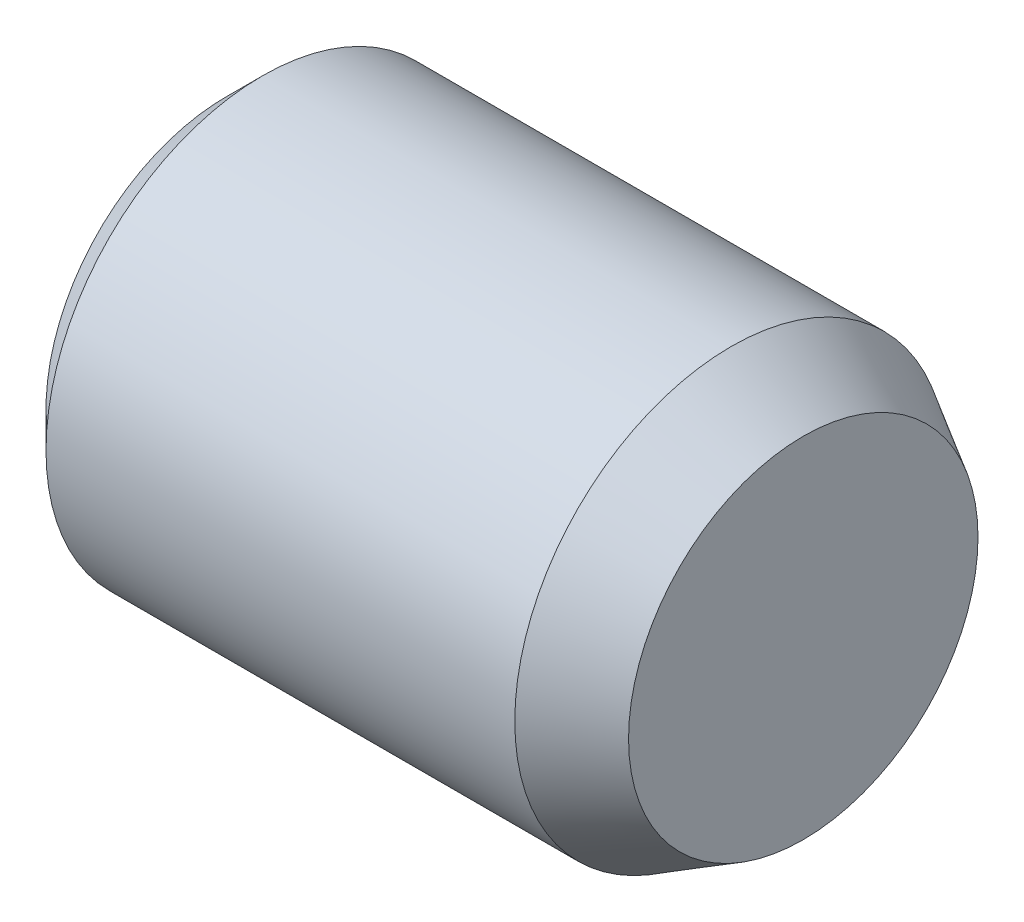
ISO-10303-21;
HEADER;
FILE_DESCRIPTION(('STEP AP214'),'2;1');
FILE_NAME('part.step','',(''),(''),'','','');
FILE_SCHEMA(('AUTOMOTIVE_DESIGN { 1 0 10303 214 1 1 1 1 }'));
ENDSEC;
DATA;
#1=APPLICATION_CONTEXT('core data for automotive mechanical design processes');
#2=APPLICATION_PROTOCOL_DEFINITION('international standard','automotive_design',2000,#1);
#3=PRODUCT_CONTEXT('',#1,'mechanical');
#4=PRODUCT('Part','Part','',(#3));
#5=PRODUCT_RELATED_PRODUCT_CATEGORY('part','',(#4));
#6=PRODUCT_DEFINITION_FORMATION('','',#4);
#7=PRODUCT_DEFINITION_CONTEXT('part definition',#1,'design');
#8=PRODUCT_DEFINITION('design','',#6,#7);
#9=PRODUCT_DEFINITION_SHAPE('','',#8);
#10=(LENGTH_UNIT() NAMED_UNIT(*) SI_UNIT(.MILLI.,.METRE.));
#11=(NAMED_UNIT(*) PLANE_ANGLE_UNIT() SI_UNIT($,.RADIAN.));
#12=(NAMED_UNIT(*) SI_UNIT($,.STERADIAN.) SOLID_ANGLE_UNIT());
#13=UNCERTAINTY_MEASURE_WITH_UNIT(LENGTH_MEASURE(1.E-05),#10,'distance_accuracy_value','');
#14=(GEOMETRIC_REPRESENTATION_CONTEXT(3) GLOBAL_UNCERTAINTY_ASSIGNED_CONTEXT((#13)) GLOBAL_UNIT_ASSIGNED_CONTEXT((#10,
#11,#12)) REPRESENTATION_CONTEXT('',''));
#15=CARTESIAN_POINT('',(0.,0.,0.));
#16=DIRECTION('',(0.,0.,1.));
#17=DIRECTION('',(1.,0.,0.));
#18=AXIS2_PLACEMENT_3D('',#15,#16,#17);
#19=CARTESIAN_POINT('',(8.00000000000001,0.,-2.42264973081037));
#20=DIRECTION('',(1.,0.,0.));
#21=DIRECTION('',(0.,0.,-1.));
#22=AXIS2_PLACEMENT_3D('',#19,#20,#21);
#23=PLANE('',#22);
#24=CARTESIAN_POINT('',(8.,0.,0.));
#25=DIRECTION('',(1.,0.,0.));
#26=DIRECTION('',(0.,0.,-1.));
#27=AXIS2_PLACEMENT_3D('',#24,#25,#26);
#28=CIRCLE('',#27,2.42264973081038);
#29=CARTESIAN_POINT('',(8.,0.,-2.42264973081037));
#30=VERTEX_POINT('',#29);
#31=EDGE_CURVE('E65',#30,#30,#28,.T.);
#32=ORIENTED_EDGE('',*,*,#31,.T.);
#33=EDGE_LOOP('',(#32));
#34=FACE_BOUND('',#33,.T.);
#35=ADVANCED_FACE('F53',(#34),#23,.T.);
#36=CARTESIAN_POINT('',(8.,0.,0.));
#37=DIRECTION('',(-1.,0.,0.));
#38=DIRECTION('',(0.,0.,1.));
#39=AXIS2_PLACEMENT_3D('',#36,#37,#38);
#40=CONICAL_SURFACE('',#39,2.42264973081038,0.523598775598298);
#41=CARTESIAN_POINT('',(6.99999999999999,0.,0.));
#42=DIRECTION('',(1.,0.,0.));
#43=DIRECTION('',(0.,0.,-1.));
#44=AXIS2_PLACEMENT_3D('',#41,#42,#43);
#45=CIRCLE('',#44,3.00000000000001);
#46=CARTESIAN_POINT('',(7.,0.,-3.));
#47=VERTEX_POINT('',#46);
#48=EDGE_CURVE('E248',#47,#47,#45,.T.);
#49=ORIENTED_EDGE('',*,*,#48,.T.);
#50=EDGE_LOOP('',(#49));
#51=FACE_BOUND('',#50,.T.);
#52=ORIENTED_EDGE('',*,*,#31,.F.);
#53=EDGE_LOOP('',(#52));
#54=FACE_BOUND('',#53,.T.);
#55=ADVANCED_FACE('F237',(#51,#54),#40,.T.);
#56=CARTESIAN_POINT('',(8.00000000000001,0.,0.));
#57=DIRECTION('',(1.,0.,0.));
#58=DIRECTION('',(0.,0.,-1.));
#59=AXIS2_PLACEMENT_3D('',#56,#57,#58);
#60=CYLINDRICAL_SURFACE('',#59,3.);
#61=CARTESIAN_POINT('',(0.499999999999996,0.,0.));
#62=DIRECTION('',(1.,0.,0.));
#63=DIRECTION('',(0.,0.,-1.));
#64=AXIS2_PLACEMENT_3D('',#61,#62,#63);
#65=CIRCLE('',#64,3.);
#66=CARTESIAN_POINT('',(0.499999999999999,0.,-3.));
#67=VERTEX_POINT('',#66);
#68=EDGE_CURVE('E251',#67,#67,#65,.T.);
#69=ORIENTED_EDGE('',*,*,#68,.T.);
#70=EDGE_LOOP('',(#69));
#71=FACE_BOUND('',#70,.T.);
#72=ORIENTED_EDGE('',*,*,#48,.F.);
#73=EDGE_LOOP('',(#72));
#74=FACE_BOUND('',#73,.T.);
#75=ADVANCED_FACE('F234',(#71,#74),#60,.T.);
#76=CARTESIAN_POINT('',(0.499999999999996,0.,0.));
#77=DIRECTION('',(1.,0.,0.));
#78=DIRECTION('',(0.,0.,-1.));
#79=AXIS2_PLACEMENT_3D('',#76,#77,#78);
#80=CONICAL_SURFACE('',#79,3.,0.785398163397452);
#81=CARTESIAN_POINT('',(0.,0.,0.));
#82=DIRECTION('',(1.,0.,0.));
#83=DIRECTION('',(0.,0.,-1.));
#84=AXIS2_PLACEMENT_3D('',#81,#82,#83);
#85=CIRCLE('',#84,2.5);
#86=CARTESIAN_POINT('',(0.,0.,-2.5));
#87=VERTEX_POINT('',#86);
#88=EDGE_CURVE('E219',#87,#87,#85,.T.);
#89=ORIENTED_EDGE('',*,*,#88,.T.);
#90=EDGE_LOOP('',(#89));
#91=FACE_BOUND('',#90,.T.);
#92=ORIENTED_EDGE('',*,*,#68,.F.);
#93=EDGE_LOOP('',(#92));
#94=FACE_BOUND('',#93,.T.);
#95=ADVANCED_FACE('F231',(#91,#94),#80,.T.);
#96=CARTESIAN_POINT('',(0.,0.,0.));
#97=DIRECTION('',(-1.,0.,0.));
#98=DIRECTION('',(0.,0.,1.));
#99=AXIS2_PLACEMENT_3D('',#96,#97,#98);
#100=PLANE('',#99);
#101=CARTESIAN_POINT('',(0.,0.,0.));
#102=DIRECTION('',(1.,0.,0.));
#103=DIRECTION('',(0.,0.,-1.));
#104=AXIS2_PLACEMENT_3D('',#101,#102,#103);
#105=CIRCLE('',#104,1.75);
#106=CARTESIAN_POINT('',(0.,1.51554445662277,0.875000000000002));
#107=VERTEX_POINT('',#106);
#108=CARTESIAN_POINT('',(0.,0.,1.75));
#109=VERTEX_POINT('',#108);
#110=EDGE_CURVE('E78',#107,#109,#105,.T.);
#111=ORIENTED_EDGE('',*,*,#110,.T.);
#112=CARTESIAN_POINT('',(0.,-1.51554445662277,0.874999999999999));
#113=VERTEX_POINT('',#112);
#114=EDGE_CURVE('E151',#109,#113,#105,.T.);
#115=ORIENTED_EDGE('',*,*,#114,.T.);
#116=CARTESIAN_POINT('',(0.,-1.51554445662277,-0.875));
#117=VERTEX_POINT('',#116);
#118=EDGE_CURVE('E150',#113,#117,#105,.T.);
#119=ORIENTED_EDGE('',*,*,#118,.T.);
#120=CARTESIAN_POINT('',(0.,0.,-1.75));
#121=VERTEX_POINT('',#120);
#122=EDGE_CURVE('E123',#117,#121,#105,.T.);
#123=ORIENTED_EDGE('',*,*,#122,.T.);
#124=CARTESIAN_POINT('',(0.,1.51554445662277,-0.875));
#125=VERTEX_POINT('',#124);
#126=EDGE_CURVE('E113',#121,#125,#105,.T.);
#127=ORIENTED_EDGE('',*,*,#126,.T.);
#128=EDGE_CURVE('E71',#125,#107,#105,.T.);
#129=ORIENTED_EDGE('',*,*,#128,.T.);
#130=EDGE_LOOP('',(#111,#115,#119,#123,#127,#129));
#131=FACE_BOUND('',#130,.T.);
#132=ORIENTED_EDGE('',*,*,#88,.F.);
#133=EDGE_LOOP('',(#132));
#134=FACE_BOUND('',#133,.T.);
#135=ADVANCED_FACE('F146',(#131,#134),#100,.T.);
#136=CARTESIAN_POINT('',(1.01036297108183,0.,0.));
#137=DIRECTION('',(-1.,0.,0.));
#138=DIRECTION('',(0.,0.,1.));
#139=AXIS2_PLACEMENT_3D('',#136,#137,#138);
#140=CONICAL_SURFACE('',#139,0.,1.0471975511966);
#141=ORIENTED_EDGE('',*,*,#122,.F.);
#142=CARTESIAN_POINT('',(-6.66732645178177E-05,0.000199999999998916,-1.75011547005384));
#143=CARTESIAN_POINT('',(0.0221449044294816,-0.0664023758266682,-1.71166257044164));
#144=CARTESIAN_POINT('',(0.0423460081489116,-0.133579654948439,-1.67287775025726));
#145=CARTESIAN_POINT('',(0.0776083474159661,-0.269097617942885,-1.59463641784239));
#146=CARTESIAN_POINT('',(0.0926571065259684,-0.337440710961869,-1.55517851469063));
#147=CARTESIAN_POINT('',(0.116084211207472,-0.473279853923202,-1.47675174893541));
#148=CARTESIAN_POINT('',(0.124618450794631,-0.540754995382695,-1.43779495785017));
#149=CARTESIAN_POINT('',(0.134809186377334,-0.67602300220127,-1.35969793770072));
#150=CARTESIAN_POINT('',(0.136474118399416,-0.743815375430541,-1.32055799276779));
#151=CARTESIAN_POINT('',(0.133022665272731,-0.870504512969003,-1.24741398510656));
#152=CARTESIAN_POINT('',(0.128753732616468,-0.929420178792214,-1.21339900958404));
#153=CARTESIAN_POINT('',(0.115219935358477,-1.04686764927936,-1.14559068088265));
#154=CARTESIAN_POINT('',(0.105950441250569,-1.10539904728372,-1.11179756248879));
#155=CARTESIAN_POINT('',(0.0827759335055034,-1.22308895120114,-1.04384926478116));
#156=CARTESIAN_POINT('',(0.0687726192813939,-1.28223255076041,-1.00970269165477));
#157=CARTESIAN_POINT('',(0.0369900311307231,-1.39963730186323,-0.94191902700142));
#158=CARTESIAN_POINT('',(0.0192182319127623,-1.45789995919933,-0.908281066104725));
#159=CARTESIAN_POINT('',(-6.66732645180497E-05,-1.51574445662277,-0.874884529946162));
#160=B_SPLINE_CURVE_WITH_KNOTS('',3,(#142,#143,#144,#145,#146,#147,#148,#149,#150,#151,#152,
#153,#154,#155,#156,#157,#158,#159),.UNSPECIFIED.,.F.,.F.,(4,2,2,2,2,2,2,2,4),(0.,
0.240241742982347,0.48106118528765,0.715919550387317,0.950489405737162,1.1547861330808,
1.35927232318102,1.56829619115677,1.776909279336),.UNSPECIFIED.);
#161=EDGE_CURVE('E12',#121,#117,#160,.T.);
#162=ORIENTED_EDGE('',*,*,#161,.F.);
#163=EDGE_LOOP('',(#141,#162));
#164=FACE_BOUND('',#163,.T.);
#165=ADVANCED_FACE('F126',(#164),#140,.F.);
#166=ORIENTED_EDGE('',*,*,#118,.F.);
#167=CARTESIAN_POINT('',(-0.563532910625823,-1.51554445662277,-2.26595890063548));
#168=CARTESIAN_POINT('',(-0.532134136522706,-1.51554445662277,-2.20051238173922));
#169=CARTESIAN_POINT('',(-0.501061575387705,-1.51554445662277,-2.13490656080575));
#170=CARTESIAN_POINT('',(-0.439753726867235,-1.51554445662277,-2.00329107063982));
#171=CARTESIAN_POINT('',(-0.40951859016251,-1.51554445662277,-1.93728133130437));
#172=CARTESIAN_POINT('',(-0.349901528563981,-1.51554445662277,-1.80439427853863));
#173=CARTESIAN_POINT('',(-0.320525891839148,-1.51554445662277,-1.73751413131939));
#174=CARTESIAN_POINT('',(-0.263092541592034,-1.51554445662277,-1.60319370986659));
#175=CARTESIAN_POINT('',(-0.235034759543454,-1.51554445662277,-1.53575346497229));
#176=CARTESIAN_POINT('',(-0.179870409798184,-1.51554445662277,-1.39842418954726));
#177=CARTESIAN_POINT('',(-0.152807880866062,-1.51554445662277,-1.32851723061006));
#178=CARTESIAN_POINT('',(-0.100941901639626,-1.51554445662277,-1.18787293487851));
#179=CARTESIAN_POINT('',(-0.0761387344229645,-1.51554445662277,-1.11713549528237));
#180=CARTESIAN_POINT('',(-0.00616431075382538,-1.51554445662277,-0.903792542480807));
#181=CARTESIAN_POINT('',(0.0347360182332324,-1.51554445662277,-0.75966597796381));
#182=CARTESIAN_POINT('',(0.0821783893640379,-1.51554445662277,-0.540592384258889));
#183=CARTESIAN_POINT('',(0.0956683672209716,-1.51554445662277,-0.467157121979347));
#184=CARTESIAN_POINT('',(0.117087506531198,-1.51554445662277,-0.319460515174022));
#185=CARTESIAN_POINT('',(0.125017043769635,-1.51554445662277,-0.245199226817297));
#186=CARTESIAN_POINT('',(0.134581825656484,-1.51554445662277,-0.0971554284905994));
#187=CARTESIAN_POINT('',(0.136291347416933,-1.51554445662277,-0.0233778427974436));
#188=CARTESIAN_POINT('',(0.133469528969136,-1.51554445662277,0.124055476761426));
#189=CARTESIAN_POINT('',(0.128937802325276,-1.51554445662277,0.197711202799313));
#190=CARTESIAN_POINT('',(0.110455270834107,-1.51554445662277,0.379445773535024));
#191=CARTESIAN_POINT('',(0.0930407915022481,-1.51554445662277,0.487172440096383));
#192=CARTESIAN_POINT('',(0.0481338740010091,-1.51554445662277,0.700530899803827));
#193=CARTESIAN_POINT('',(0.0206292894732057,-1.51554445662277,0.806160005705216));
#194=CARTESIAN_POINT('',(-0.026355262163589,-1.51554445662277,0.964139948179183));
#195=CARTESIAN_POINT('',(-0.043190525892397,-1.51554445662277,1.01730740210717));
#196=CARTESIAN_POINT('',(-0.0784184116572895,-1.51554445662277,1.12308887131315));
#197=CARTESIAN_POINT('',(-0.0968100617815138,-1.51554445662277,1.17570320924792));
#198=CARTESIAN_POINT('',(-0.134883619482846,-1.51554445662277,1.28044875805814));
#199=CARTESIAN_POINT('',(-0.154565292575557,-1.51554445662277,1.33258005477944));
#200=CARTESIAN_POINT('',(-0.19500600733766,-1.51554445662277,1.43643187136538));
#201=CARTESIAN_POINT('',(-0.215765231032693,-1.51554445662277,1.48815232011474));
#202=CARTESIAN_POINT('',(-0.270083826942637,-1.51554445662277,1.62017096585258));
#203=CARTESIAN_POINT('',(-0.304284098149476,-1.51554445662277,1.70020518507784));
#204=CARTESIAN_POINT('',(-0.374333292503037,-1.51554445662277,1.85955088568122));
#205=CARTESIAN_POINT('',(-0.410182339157162,-1.51554445662277,1.93886231238105));
#206=CARTESIAN_POINT('',(-0.519621429974216,-1.51554445662277,2.17595323636037));
#207=CARTESIAN_POINT('',(-0.595092205304239,-1.51554445662277,2.33286289433754));
#208=CARTESIAN_POINT('',(-0.749198987368698,-1.51554445662277,2.64534167964294));
#209=CARTESIAN_POINT('',(-0.827838771195659,-1.51554445662277,2.80090892186687));
#210=CARTESIAN_POINT('',(-0.987140420712237,-1.51554445662277,3.11097754763085));
#211=CARTESIAN_POINT('',(-1.0678020293755,-1.51554445662277,3.26547906349981));
#212=CARTESIAN_POINT('',(-1.22283902934283,-1.51554445662277,3.55919636558155));
#213=CARTESIAN_POINT('',(-1.29708915995521,-1.51554445662277,3.69847850014597));
#214=CARTESIAN_POINT('',(-1.44643542457996,-1.51554445662277,3.97659474012283));
#215=CARTESIAN_POINT('',(-1.52153158990073,-1.51554445662277,4.11542882870866));
#216=CARTESIAN_POINT('',(-1.67216594590895,-1.51554445662277,4.39239913173627));
#217=CARTESIAN_POINT('',(-1.74770252645472,-1.51554445662277,4.53053622304851));
#218=CARTESIAN_POINT('',(-1.89926732048614,-1.51554445662277,4.80653112590675));
#219=CARTESIAN_POINT('',(-1.97529550803658,-1.51554445662277,4.94438895168981));
#220=CARTESIAN_POINT('',(-2.05150396895533,-1.51554445662277,5.08214644372616));
#221=B_SPLINE_CURVE_WITH_KNOTS('',3,(#167,#168,#169,#170,#171,#172,#173,#174,#175,#176,#177,
#178,#179,#180,#181,#182,#183,#184,#185,#186,#187,#188,#189,#190,#191,#192,#193,#194,#195,#196,
#197,#198,#199,#200,#201,#202,#203,#204,#205,#206,#207,#208,#209,#210,#211,#212,#213,#214,#215,
#216,#217,#218,#219,#220),.UNSPECIFIED.,.F.,.F.,(4,2,2,2,2,2,2,2,2,2,2,2,2,2,2,2,2,2,2,2,2,2,2,
2,2,2,4),(0.,0.217769099854901,0.435577132416358,0.654706396228358,0.873824253032143,
1.09867004545086,1.32354397038355,1.77202325337813,1.99584540337777,2.21965242559296,
2.44077789001242,2.66191704633946,2.98862090595863,3.31571934559679,3.48300853865819,
3.65019402532678,3.81734920691363,3.98453271773258,4.24561154627739,4.50670996381743,
5.02899303776686,5.55191817592407,6.07477717055938,6.54828558680916,7.02181158367171,
7.49413315360125,7.96643000581034),.UNSPECIFIED.);
#222=EDGE_CURVE('E121',#117,#113,#221,.T.);
#223=ORIENTED_EDGE('',*,*,#222,.F.);
#224=EDGE_LOOP('',(#166,#223));
#225=FACE_BOUND('',#224,.T.);
#226=ADVANCED_FACE('F291',(#225),#140,.F.);
#227=ORIENTED_EDGE('',*,*,#114,.F.);
#228=CARTESIAN_POINT('',(-6.66732645185368E-05,-1.51574445662277,0.874884529946163));
#229=CARTESIAN_POINT('',(0.0221449044294809,-1.4491420807961,0.913337429558358));
#230=CARTESIAN_POINT('',(0.042346008148911,-1.38196480167433,0.952122249742738));
#231=CARTESIAN_POINT('',(0.0776083474159657,-1.24644683867988,1.03036358215761));
#232=CARTESIAN_POINT('',(0.0926571065259681,-1.1781037456609,1.06982148530937));
#233=CARTESIAN_POINT('',(0.116084211207472,-1.04226460269957,1.14824825106459));
#234=CARTESIAN_POINT('',(0.12461845079463,-0.974789461240073,1.18720504214983));
#235=CARTESIAN_POINT('',(0.134809186377333,-0.839521454421498,1.26530206229928));
#236=CARTESIAN_POINT('',(0.136474118399415,-0.771729081192227,1.30444200723221));
#237=CARTESIAN_POINT('',(0.133022665272731,-0.645039943653765,1.37758601489344));
#238=CARTESIAN_POINT('',(0.128753732616468,-0.586124277830555,1.41160099041595));
#239=CARTESIAN_POINT('',(0.115219935358476,-0.468676807343404,1.47940931911735));
#240=CARTESIAN_POINT('',(0.105950441250569,-0.410145409339049,1.51320243751121));
#241=CARTESIAN_POINT('',(0.0827759335055031,-0.29245550542163,1.58115073521883));
#242=CARTESIAN_POINT('',(0.0687726192813938,-0.233311905862355,1.61529730834522));
#243=CARTESIAN_POINT('',(0.0369900311307233,-0.115907154759535,1.68308097299858));
#244=CARTESIAN_POINT('',(0.0192182319127625,-0.0576444974234433,1.71671893389527));
#245=CARTESIAN_POINT('',(-6.66732645178481E-05,0.000199999999998933,1.75011547005384));
#246=B_SPLINE_CURVE_WITH_KNOTS('',3,(#228,#229,#230,#231,#232,#233,#234,#235,#236,#237,#238,
#239,#240,#241,#242,#243,#244,#245),.UNSPECIFIED.,.F.,.F.,(4,2,2,2,2,2,2,2,4),(0.,
0.240241742982347,0.48106118528765,0.715919550387317,0.950489405737162,1.1547861330808,
1.35927232318102,1.56829619115677,1.776909279336),.UNSPECIFIED.);
#247=EDGE_CURVE('E159',#113,#109,#246,.T.);
#248=ORIENTED_EDGE('',*,*,#247,.F.);
#249=EDGE_LOOP('',(#227,#248));
#250=FACE_BOUND('',#249,.T.);
#251=ADVANCED_FACE('F298',(#250),#140,.F.);
#252=ORIENTED_EDGE('',*,*,#110,.F.);
#253=CARTESIAN_POINT('',(-6.66732645191923E-05,-0.000200000000001084,1.75011547005384));
#254=CARTESIAN_POINT('',(0.0221449044294803,0.0664023758266661,1.71166257044164));
#255=CARTESIAN_POINT('',(0.0423460081489104,0.133579654948437,1.67287775025726));
#256=CARTESIAN_POINT('',(0.077608347415965,0.269097617942883,1.59463641784239));
#257=CARTESIAN_POINT('',(0.0926571065259673,0.337440710961867,1.55517851469063));
#258=CARTESIAN_POINT('',(0.116084211207471,0.4732798539232,1.47675174893542));
#259=CARTESIAN_POINT('',(0.12461845079463,0.540754995382694,1.43779495785017));
#260=CARTESIAN_POINT('',(0.134809186377333,0.676023002201269,1.35969793770072));
#261=CARTESIAN_POINT('',(0.136474118399415,0.74381537543054,1.3205579927678));
#262=CARTESIAN_POINT('',(0.133022665272731,0.870504512969002,1.24741398510656));
#263=CARTESIAN_POINT('',(0.128753732616468,0.929420178792213,1.21339900958405));
#264=CARTESIAN_POINT('',(0.115219935358476,1.04686764927936,1.14559068088265));
#265=CARTESIAN_POINT('',(0.105950441250569,1.10539904728372,1.11179756248879));
#266=CARTESIAN_POINT('',(0.0827759335055029,1.22308895120114,1.04384926478117));
#267=CARTESIAN_POINT('',(0.0687726192813935,1.28223255076041,1.00970269165478));
#268=CARTESIAN_POINT('',(0.0369900311307229,1.39963730186323,0.941919027001423));
#269=CARTESIAN_POINT('',(0.0192182319127622,1.45789995919932,0.908281066104727));
#270=CARTESIAN_POINT('',(-6.66732645180673E-05,1.51574445662277,0.874884529946164));
#271=B_SPLINE_CURVE_WITH_KNOTS('',3,(#253,#254,#255,#256,#257,#258,#259,#260,#261,#262,#263,
#264,#265,#266,#267,#268,#269,#270),.UNSPECIFIED.,.F.,.F.,(4,2,2,2,2,2,2,2,4),(0.,
0.240241742982347,0.481061185287651,0.715919550387318,0.950489405737162,1.1547861330808,
1.35927232318102,1.56829619115677,1.776909279336),.UNSPECIFIED.);
#272=EDGE_CURVE('E179',#109,#107,#271,.T.);
#273=ORIENTED_EDGE('',*,*,#272,.F.);
#274=EDGE_LOOP('',(#252,#273));
#275=FACE_BOUND('',#274,.T.);
#276=ADVANCED_FACE('F305',(#275),#140,.F.);
#277=ORIENTED_EDGE('',*,*,#128,.F.);
#278=CARTESIAN_POINT('',(-0.563532910625823,1.51554445662277,-2.26595890063548));
#279=CARTESIAN_POINT('',(-0.532134136522706,1.51554445662277,-2.20051238173922));
#280=CARTESIAN_POINT('',(-0.501061575387705,1.51554445662277,-2.13490656080575));
#281=CARTESIAN_POINT('',(-0.439753726867235,1.51554445662277,-2.00329107063982));
#282=CARTESIAN_POINT('',(-0.409518590162509,1.51554445662277,-1.93728133130437));
#283=CARTESIAN_POINT('',(-0.349901528563981,1.51554445662277,-1.80439427853864));
#284=CARTESIAN_POINT('',(-0.320525891839148,1.51554445662277,-1.73751413131939));
#285=CARTESIAN_POINT('',(-0.263092541592034,1.51554445662277,-1.60319370986659));
#286=CARTESIAN_POINT('',(-0.235034759543453,1.51554445662277,-1.53575346497229));
#287=CARTESIAN_POINT('',(-0.179870409798184,1.51554445662277,-1.39842418954726));
#288=CARTESIAN_POINT('',(-0.152807880866062,1.51554445662277,-1.32851723061006));
#289=CARTESIAN_POINT('',(-0.100941901639626,1.51554445662277,-1.18787293487851));
#290=CARTESIAN_POINT('',(-0.0761387344229642,1.51554445662277,-1.11713549528237));
#291=CARTESIAN_POINT('',(-0.00616431075382491,1.51554445662277,-0.903792542480807));
#292=CARTESIAN_POINT('',(0.034736018233233,1.51554445662277,-0.75966597796381));
#293=CARTESIAN_POINT('',(0.0821783893640384,1.51554445662277,-0.540592384258889));
#294=CARTESIAN_POINT('',(0.0956683672209721,1.51554445662277,-0.467157121979347));
#295=CARTESIAN_POINT('',(0.117087506531198,1.51554445662277,-0.319460515174023));
#296=CARTESIAN_POINT('',(0.125017043769635,1.51554445662277,-0.245199226817297));
#297=CARTESIAN_POINT('',(0.134581825656485,1.51554445662277,-0.0971554284905998));
#298=CARTESIAN_POINT('',(0.136291347416933,1.51554445662277,-0.0233778427974439));
#299=CARTESIAN_POINT('',(0.133469528969136,1.51554445662277,0.124055476761426));
#300=CARTESIAN_POINT('',(0.128937802325276,1.51554445662277,0.197711202799313));
#301=CARTESIAN_POINT('',(0.110455270834108,1.51554445662277,0.379445773535023));
#302=CARTESIAN_POINT('',(0.0930407915022486,1.51554445662277,0.487172440096382));
#303=CARTESIAN_POINT('',(0.0481338740010096,1.51554445662277,0.700530899803827));
#304=CARTESIAN_POINT('',(0.0206292894732061,1.51554445662277,0.806160005705215));
#305=CARTESIAN_POINT('',(-0.0263552621635885,1.51554445662277,0.964139948179182));
#306=CARTESIAN_POINT('',(-0.0431905258923964,1.51554445662277,1.01730740210717));
#307=CARTESIAN_POINT('',(-0.0784184116572886,1.51554445662277,1.12308887131315));
#308=CARTESIAN_POINT('',(-0.0968100617815129,1.51554445662277,1.17570320924792));
#309=CARTESIAN_POINT('',(-0.134883619482846,1.51554445662277,1.28044875805814));
#310=CARTESIAN_POINT('',(-0.154565292575556,1.51554445662277,1.33258005477944));
#311=CARTESIAN_POINT('',(-0.195006007337659,1.51554445662277,1.43643187136538));
#312=CARTESIAN_POINT('',(-0.215765231032692,1.51554445662277,1.48815232011474));
#313=CARTESIAN_POINT('',(-0.270083826942635,1.51554445662277,1.62017096585258));
#314=CARTESIAN_POINT('',(-0.304284098149475,1.51554445662277,1.70020518507784));
#315=CARTESIAN_POINT('',(-0.374333292503036,1.51554445662277,1.85955088568121));
#316=CARTESIAN_POINT('',(-0.410182339157161,1.51554445662277,1.93886231238104));
#317=CARTESIAN_POINT('',(-0.519621429974215,1.51554445662277,2.17595323636037));
#318=CARTESIAN_POINT('',(-0.595092205304238,1.51554445662277,2.33286289433754));
#319=CARTESIAN_POINT('',(-0.749198987368696,1.51554445662277,2.64534167964294));
#320=CARTESIAN_POINT('',(-0.827838771195657,1.51554445662277,2.80090892186687));
#321=CARTESIAN_POINT('',(-0.987140420712236,1.51554445662277,3.11097754763084));
#322=CARTESIAN_POINT('',(-1.0678020293755,1.51554445662277,3.26547906349981));
#323=CARTESIAN_POINT('',(-1.22283902934283,1.51554445662277,3.55919636558155));
#324=CARTESIAN_POINT('',(-1.29708915995521,1.51554445662277,3.69847850014597));
#325=CARTESIAN_POINT('',(-1.44643542457996,1.51554445662277,3.97659474012283));
#326=CARTESIAN_POINT('',(-1.52153158990073,1.51554445662277,4.11542882870866));
#327=CARTESIAN_POINT('',(-1.67216594590894,1.51554445662277,4.39239913173627));
#328=CARTESIAN_POINT('',(-1.74770252645472,1.51554445662277,4.53053622304852));
#329=CARTESIAN_POINT('',(-1.89926732048614,1.51554445662277,4.80653112590675));
#330=CARTESIAN_POINT('',(-1.97529550803658,1.51554445662277,4.94438895168981));
#331=CARTESIAN_POINT('',(-2.05150396895533,1.51554445662277,5.08214644372616));
#332=B_SPLINE_CURVE_WITH_KNOTS('',3,(#278,#279,#280,#281,#282,#283,#284,#285,#286,#287,#288,
#289,#290,#291,#292,#293,#294,#295,#296,#297,#298,#299,#300,#301,#302,#303,#304,#305,#306,#307,
#308,#309,#310,#311,#312,#313,#314,#315,#316,#317,#318,#319,#320,#321,#322,#323,#324,#325,#326,
#327,#328,#329,#330,#331),.UNSPECIFIED.,.F.,.F.,(4,2,2,2,2,2,2,2,2,2,2,2,2,2,2,2,2,2,2,2,2,2,2,
2,2,2,4),(0.,0.217769099854902,0.435577132416358,0.654706396228358,0.873824253032144,
1.09867004545087,1.32354397038355,1.77202325337813,1.99584540337777,2.21965242559296,
2.44077789001242,2.66191704633946,2.98862090595863,3.31571934559679,3.48300853865819,
3.65019402532678,3.81734920691363,3.98453271773258,4.24561154627739,4.50670996381743,
5.02899303776686,5.55191817592407,6.07477717055938,6.54828558680916,7.02181158367171,
7.49413315360126,7.96643000581035),.UNSPECIFIED.);
#333=EDGE_CURVE('E138',#107,#125,#332,.F.);
#334=ORIENTED_EDGE('',*,*,#333,.F.);
#335=EDGE_LOOP('',(#277,#334));
#336=FACE_BOUND('',#335,.T.);
#337=ADVANCED_FACE('F172',(#336),#140,.F.);
#338=ORIENTED_EDGE('',*,*,#126,.F.);
#339=CARTESIAN_POINT('',(-6.66732645182522E-05,1.51574445662277,-0.874884529946163));
#340=CARTESIAN_POINT('',(0.0221449044294811,1.4491420807961,-0.913337429558357));
#341=CARTESIAN_POINT('',(0.0423460081489111,1.38196480167433,-0.952122249742738));
#342=CARTESIAN_POINT('',(0.0776083474159657,1.24644683867988,-1.03036358215761));
#343=CARTESIAN_POINT('',(0.092657106525968,1.1781037456609,-1.06982148530937));
#344=CARTESIAN_POINT('',(0.116084211207472,1.04226460269957,-1.14824825106459));
#345=CARTESIAN_POINT('',(0.12461845079463,0.974789461240073,-1.18720504214983));
#346=CARTESIAN_POINT('',(0.134809186377334,0.839521454421498,-1.26530206229928));
#347=CARTESIAN_POINT('',(0.136474118399416,0.771729081192226,-1.3044420072322));
#348=CARTESIAN_POINT('',(0.133022665272732,0.645039943653765,-1.37758601489344));
#349=CARTESIAN_POINT('',(0.128753732616468,0.586124277830554,-1.41160099041595));
#350=CARTESIAN_POINT('',(0.115219935358476,0.468676807343403,-1.47940931911735));
#351=CARTESIAN_POINT('',(0.105950441250569,0.410145409339048,-1.51320243751121));
#352=CARTESIAN_POINT('',(0.0827759335055034,0.292455505421628,-1.58115073521883));
#353=CARTESIAN_POINT('',(0.0687726192813939,0.233311905862353,-1.61529730834523));
#354=CARTESIAN_POINT('',(0.0369900311307231,0.115907154759533,-1.68308097299858));
#355=CARTESIAN_POINT('',(0.0192182319127622,0.0576444974234413,-1.71671893389527));
#356=CARTESIAN_POINT('',(-6.66732645180823E-05,-0.000200000000001198,-1.75011547005384));
#357=B_SPLINE_CURVE_WITH_KNOTS('',3,(#339,#340,#341,#342,#343,#344,#345,#346,#347,#348,#349,
#350,#351,#352,#353,#354,#355,#356),.UNSPECIFIED.,.F.,.F.,(4,2,2,2,2,2,2,2,4),(0.,
0.240241742982347,0.48106118528765,0.715919550387317,0.950489405737162,1.1547861330808,
1.35927232318102,1.56829619115677,1.776909279336),.UNSPECIFIED.);
#358=EDGE_CURVE('E117',#125,#121,#357,.T.);
#359=ORIENTED_EDGE('',*,*,#358,.F.);
#360=EDGE_LOOP('',(#338,#359));
#361=FACE_BOUND('',#360,.T.);
#362=ADVANCED_FACE('F115',(#361),#140,.F.);
#363=CARTESIAN_POINT('',(4.,0.,0.));
#364=DIRECTION('',(-1.,0.,0.));
#365=DIRECTION('',(0.,0.,1.));
#366=AXIS2_PLACEMENT_3D('',#363,#364,#365);
#367=CONICAL_SURFACE('',#366,1.75,1.02974425867666);
#368=CARTESIAN_POINT('',(5.05150608329823,0.,0.));
#369=VERTEX_POINT('',#368);
#370=VERTEX_LOOP('',#369);
#371=FACE_BOUND('',#370,.T.);
#372=CARTESIAN_POINT('',(3.99993061172545,0.000199999999998916,-1.75011547005383));
#373=CARTESIAN_POINT('',(4.02312978255284,-0.066643511224289,-1.71152335085491));
#374=CARTESIAN_POINT('',(4.044238639375,-0.13411198095802,-1.67257041169233));
#375=CARTESIAN_POINT('',(4.08107492585255,-0.270318736188018,-1.59393140489484));
#376=CARTESIAN_POINT('',(4.09678793870248,-0.339059914191636,-1.55424366727004));
#377=CARTESIAN_POINT('',(4.12116391336489,-0.475618777964751,-1.4754013705104));
#378=CARTESIAN_POINT('',(4.13000473498288,-0.543411749780571,-1.43626107998338));
#379=CARTESIAN_POINT('',(4.14045084399471,-0.679335849755788,-1.35778526427333));
#380=CARTESIAN_POINT('',(4.14206596183594,-0.747466392163593,-1.31845007727415));
#381=CARTESIAN_POINT('',(4.13820831362816,-0.874177434341476,-1.24529342296345));
#382=CARTESIAN_POINT('',(4.13368065964179,-0.93278149918582,-1.21145835034996));
#383=CARTESIAN_POINT('',(4.11949540929416,-1.04957435386335,-1.14402796426246));
#384=CARTESIAN_POINT('',(4.10983263258805,-1.10776266409888,-1.11043292768429));
#385=CARTESIAN_POINT('',(4.08573875441452,-1.2248093363455,-1.04285599995496));
#386=CARTESIAN_POINT('',(4.07119930563622,-1.28365052197091,-1.00888402559469));
#387=CARTESIAN_POINT('',(4.03825830668378,-1.40038938198647,-0.941484813339814));
#388=CARTESIAN_POINT('',(4.01986509457651,-1.45828880718201,-0.908056564617243));
#389=CARTESIAN_POINT('',(3.99993061172545,-1.51574445662277,-0.874884529946158));
#390=B_SPLINE_CURVE_WITH_KNOTS('',3,(#372,#373,#374,#375,#376,#377,#378,#379,#380,#381,#382,
#383,#384,#385,#386,#387,#388,#389),.UNSPECIFIED.,.F.,.F.,(4,2,2,2,2,2,2,2,4),(0.,
0.241892866519844,0.48442709200679,0.720453423557589,0.956158547446905,1.15941647224327,
1.36287983526831,1.57120142893061,1.77907686482121),.UNSPECIFIED.);
#391=CARTESIAN_POINT('',(4.00000000013279,0.,-1.75));
#392=VERTEX_POINT('',#391);
#393=CARTESIAN_POINT('',(4.00000000013279,-1.51554445662277,-0.874999999999996));
#394=VERTEX_POINT('',#393);
#395=EDGE_CURVE('E137',#392,#394,#390,.T.);
#396=ORIENTED_EDGE('',*,*,#395,.T.);
#397=CARTESIAN_POINT('',(3.44394946287935,-1.51554445662277,-2.20477116834827));
#398=CARTESIAN_POINT('',(3.47513767387387,-1.51554445662277,-2.14176662732364));
#399=CARTESIAN_POINT('',(3.50599641725884,-1.51554445662277,-2.07859607982414));
#400=CARTESIAN_POINT('',(3.56687308408326,-1.51554445662277,-1.95183715248289));
#401=CARTESIAN_POINT('',(3.59689084990876,-1.51554445662277,-1.8882486970386));
#402=CARTESIAN_POINT('',(3.656072354961,-1.51554445662277,-1.76020115159948));
#403=CARTESIAN_POINT('',(3.68522974789336,-1.51554445662277,-1.69573911534071));
#404=CARTESIAN_POINT('',(3.74223104806476,-1.51554445662277,-1.56624018194101));
#405=CARTESIAN_POINT('',(3.77007502487836,-1.51554445662277,-1.5012033154673));
#406=CARTESIAN_POINT('',(3.82483366815613,-1.51554445662277,-1.36869623128351));
#407=CARTESIAN_POINT('',(3.85170377966871,-1.51554445662277,-1.30120736115184));
#408=CARTESIAN_POINT('',(3.90321280142428,-1.51554445662277,-1.16538607752468));
#409=CARTESIAN_POINT('',(3.92785143477025,-1.51554445662277,-1.09705356053591));
#410=CARTESIAN_POINT('',(3.99740834024518,-1.51554445662277,-0.890898440056524));
#411=CARTESIAN_POINT('',(4.03812986344837,-1.51554445662277,-0.751542769915356));
#412=CARTESIAN_POINT('',(4.08627378776149,-1.51554445662277,-0.53691755440833));
#413=CARTESIAN_POINT('',(4.10028577847681,-1.51554445662277,-0.463134164635642));
#414=CARTESIAN_POINT('',(4.12245639714313,-1.51554445662277,-0.314674130110818));
#415=CARTESIAN_POINT('',(4.13061567622591,-1.51554445662277,-0.239997585664924));
#416=CARTESIAN_POINT('',(4.14029814651932,-1.51554445662277,-0.0911464021397401));
#417=CARTESIAN_POINT('',(4.1419034259385,-1.51554445662277,-0.0169772452002372));
#418=CARTESIAN_POINT('',(4.13855380808742,-1.51554445662277,0.1312122207318));
#419=CARTESIAN_POINT('',(4.13359828099859,-1.51554445662277,0.205232514750721));
#420=CARTESIAN_POINT('',(4.11429209585217,-1.51554445662277,0.38269378609536));
#421=CARTESIAN_POINT('',(4.09693124304145,-1.51554445662277,0.485805686318812));
#422=CARTESIAN_POINT('',(4.05259610784752,-1.51554445662277,0.689967258813894));
#423=CARTESIAN_POINT('',(4.0256107534146,-1.51554445662277,0.791014413653144));
#424=CARTESIAN_POINT('',(3.97959292360287,-1.51554445662277,0.942116274454579));
#425=CARTESIAN_POINT('',(3.96311153553945,-1.51554445662277,0.992976772455835));
#426=CARTESIAN_POINT('',(3.9286358559952,-1.51554445662277,1.09414965509222));
#427=CARTESIAN_POINT('',(3.91064248622339,-1.51554445662277,1.14446235283712));
#428=CARTESIAN_POINT('',(3.87339411247579,-1.51554445662277,1.24460638552714));
#429=CARTESIAN_POINT('',(3.85413930444988,-1.51554445662277,1.29443779386161));
#430=CARTESIAN_POINT('',(3.81457064587376,-1.51554445662277,1.39368639031997));
#431=CARTESIAN_POINT('',(3.79425662280393,-1.51554445662277,1.44310350943545));
#432=CARTESIAN_POINT('',(3.7393488382135,-1.51554445662277,1.57335143700677));
#433=CARTESIAN_POINT('',(3.70400325542939,-1.51554445662277,1.65386506999136));
#434=CARTESIAN_POINT('',(3.63151536000531,-1.51554445662277,1.81408183900255));
#435=CARTESIAN_POINT('',(3.59437288474355,-1.51554445662277,1.89378490087815));
#436=CARTESIAN_POINT('',(3.48089391156219,-1.51554445662277,2.13195595843455));
#437=CARTESIAN_POINT('',(3.40252080800558,-1.51554445662277,2.28945148995371));
#438=CARTESIAN_POINT('',(3.24237053844317,-1.51554445662277,2.60296531907651));
#439=CARTESIAN_POINT('',(3.16058865262735,-1.51554445662277,2.75898117473437));
#440=CARTESIAN_POINT('',(2.9948753017781,-1.51554445662277,3.06983352118651));
#441=CARTESIAN_POINT('',(2.91094417205656,-1.51554445662277,3.22467019111847));
#442=CARTESIAN_POINT('',(2.75014752904129,-1.51554445662277,3.51795813222745));
#443=CARTESIAN_POINT('',(2.67342310653527,-1.51554445662277,3.65648704301218));
#444=CARTESIAN_POINT('',(2.51909304584474,-1.51554445662277,3.93306096834727));
#445=CARTESIAN_POINT('',(2.44148736779274,-1.51554445662277,4.07110596063274));
#446=CARTESIAN_POINT('',(2.28584700631652,-1.51554445662277,4.34641700513239));
#447=CARTESIAN_POINT('',(2.20781426011486,-1.51554445662277,4.48368415402935));
#448=CARTESIAN_POINT('',(2.05123963289651,-1.51554445662277,4.7579165762399));
#449=CARTESIAN_POINT('',(1.97269778381637,-1.51554445662277,4.89488186778067));
#450=CARTESIAN_POINT('',(1.89396931080474,-1.51554445662277,5.03173913494216));
#451=B_SPLINE_CURVE_WITH_KNOTS('',3,(#397,#398,#399,#400,#401,#402,#403,#404,#405,#406,#407,
#408,#409,#410,#411,#412,#413,#414,#415,#416,#417,#418,#419,#420,#421,#422,#423,#424,#425,#426,
#427,#428,#429,#430,#431,#432,#433,#434,#435,#436,#437,#438,#439,#440,#441,#442,#443,#444,#445,
#446,#447,#448,#449,#450),.UNSPECIFIED.,.F.,.F.,(4,2,2,2,2,2,2,2,2,2,2,2,2,2,2,2,2,2,2,2,2,2,2,
2,2,2,4),(0.,0.210906842353481,0.421852951449182,0.634089248314153,0.84631428989865,
1.06419630816285,1.28210532577587,1.71669827860272,1.94181742182629,2.16691151598143,
2.38917751477212,2.61146485200726,2.92452429532231,3.23794505082098,3.3983194848325,
3.55859685361551,3.71884938392284,3.87912809738844,4.14288685327265,4.40666952458695,
4.93434713561652,5.46278136123423,5.99113364011097,6.46620062880424,6.94128919555863,
7.41497823739837,7.88863784639671),.UNSPECIFIED.);
#452=CARTESIAN_POINT('',(4.00000000013279,-1.51554445662277,0.875000000000003));
#453=VERTEX_POINT('',#452);
#454=EDGE_CURVE('E376',#394,#453,#451,.T.);
#455=ORIENTED_EDGE('',*,*,#454,.T.);
#456=CARTESIAN_POINT('',(3.99993061172545,-1.51574445662277,0.874884529946167));
#457=CARTESIAN_POINT('',(4.02312978255283,-1.44890094539848,0.913476649145089));
#458=CARTESIAN_POINT('',(4.04423863937499,-1.38143247566475,0.952429588307671));
#459=CARTESIAN_POINT('',(4.08107492585255,-1.24522572043475,1.03106859510516));
#460=CARTESIAN_POINT('',(4.09678793870248,-1.17648454243113,1.07075633272996));
#461=CARTESIAN_POINT('',(4.12116391336489,-1.03992567865802,1.14959862948959));
#462=CARTESIAN_POINT('',(4.13000473498287,-0.972132706842197,1.18873892001662));
#463=CARTESIAN_POINT('',(4.14045084399471,-0.836208606866981,1.26721473572667));
#464=CARTESIAN_POINT('',(4.14206596183593,-0.768078064459176,1.30654992272585));
#465=CARTESIAN_POINT('',(4.13820831362815,-0.641367022281293,1.37970657703655));
#466=CARTESIAN_POINT('',(4.13368065964179,-0.582762957436948,1.41354164965004));
#467=CARTESIAN_POINT('',(4.11949540929416,-0.46597010275942,1.48097203573754));
#468=CARTESIAN_POINT('',(4.10983263258805,-0.407781792523889,1.51456707231571));
#469=CARTESIAN_POINT('',(4.08573875441452,-0.290735120277274,1.58214400004504));
#470=CARTESIAN_POINT('',(4.07119930563622,-0.231893934651858,1.61611597440531));
#471=CARTESIAN_POINT('',(4.03825830668377,-0.1151550746363,1.68351518666019));
#472=CARTESIAN_POINT('',(4.0198650945765,-0.0572556494407582,1.71694343538276));
#473=CARTESIAN_POINT('',(3.99993061172545,0.000199999999998886,1.75011547005384));
#474=B_SPLINE_CURVE_WITH_KNOTS('',3,(#456,#457,#458,#459,#460,#461,#462,#463,#464,#465,#466,
#467,#468,#469,#470,#471,#472,#473),.UNSPECIFIED.,.F.,.F.,(4,2,2,2,2,2,2,2,4),(0.,
0.241892866519845,0.48442709200679,0.720453423557589,0.956158547446906,1.15941647224327,
1.36287983526831,1.57120142893061,1.77907686482121),.UNSPECIFIED.);
#475=CARTESIAN_POINT('',(4.00000000013279,0.,1.75));
#476=VERTEX_POINT('',#475);
#477=EDGE_CURVE('E365',#453,#476,#474,.T.);
#478=ORIENTED_EDGE('',*,*,#477,.T.);
#479=CARTESIAN_POINT('',(3.99993061172545,-0.000200000000001084,1.75011547005384));
#480=CARTESIAN_POINT('',(4.02312978255283,0.0666435112242869,1.71152335085492));
#481=CARTESIAN_POINT('',(4.04423863937499,0.134111980958018,1.67257041169234));
#482=CARTESIAN_POINT('',(4.08107492585255,0.270318736188017,1.59393140489485));
#483=CARTESIAN_POINT('',(4.09678793870248,0.339059914191635,1.55424366727005));
#484=CARTESIAN_POINT('',(4.12116391336488,0.47561877796475,1.47540137051042));
#485=CARTESIAN_POINT('',(4.13000473498287,0.54341174978057,1.43626107998339));
#486=CARTESIAN_POINT('',(4.14045084399471,0.679335849755787,1.35778526427334));
#487=CARTESIAN_POINT('',(4.14206596183593,0.747466392163591,1.31845007727416));
#488=CARTESIAN_POINT('',(4.13820831362815,0.874177434341474,1.24529342296346));
#489=CARTESIAN_POINT('',(4.13368065964179,0.932781499185819,1.21145835034997));
#490=CARTESIAN_POINT('',(4.11949540929416,1.04957435386335,1.14402796426247));
#491=CARTESIAN_POINT('',(4.10983263258805,1.10776266409888,1.1104329276843));
#492=CARTESIAN_POINT('',(4.08573875441452,1.22480933634549,1.04285599995497));
#493=CARTESIAN_POINT('',(4.07119930563622,1.28365052197091,1.0088840255947));
#494=CARTESIAN_POINT('',(4.03825830668377,1.40038938198647,0.941484813339825));
#495=CARTESIAN_POINT('',(4.0198650945765,1.45828880718201,0.908056564617254));
#496=CARTESIAN_POINT('',(3.99993061172545,1.51574445662277,0.874884529946168));
#497=B_SPLINE_CURVE_WITH_KNOTS('',3,(#479,#480,#481,#482,#483,#484,#485,#486,#487,#488,#489,
#490,#491,#492,#493,#494,#495,#496),.UNSPECIFIED.,.F.,.F.,(4,2,2,2,2,2,2,2,4),(0.,
0.241892866519845,0.484427092006791,0.72045342355759,0.956158547446907,1.15941647224327,
1.36287983526831,1.57120142893061,1.77907686482121),.UNSPECIFIED.);
#498=CARTESIAN_POINT('',(4.00000000013279,1.51554445662277,0.875000000000006));
#499=VERTEX_POINT('',#498);
#500=EDGE_CURVE('E357',#476,#499,#497,.T.);
#501=ORIENTED_EDGE('',*,*,#500,.T.);
#502=CARTESIAN_POINT('',(3.44394946287935,1.51554445662277,-2.20477116834827));
#503=CARTESIAN_POINT('',(3.47513767387387,1.51554445662277,-2.14176662732364));
#504=CARTESIAN_POINT('',(3.50599641725884,1.51554445662277,-2.07859607982414));
#505=CARTESIAN_POINT('',(3.56687308408326,1.51554445662277,-1.95183715248289));
#506=CARTESIAN_POINT('',(3.59689084990876,1.51554445662277,-1.8882486970386));
#507=CARTESIAN_POINT('',(3.656072354961,1.51554445662277,-1.76020115159948));
#508=CARTESIAN_POINT('',(3.68522974789336,1.51554445662277,-1.69573911534071));
#509=CARTESIAN_POINT('',(3.74223104806476,1.51554445662277,-1.56624018194101));
#510=CARTESIAN_POINT('',(3.77007502487836,1.51554445662277,-1.5012033154673));
#511=CARTESIAN_POINT('',(3.82483366815613,1.51554445662277,-1.36869623128351));
#512=CARTESIAN_POINT('',(3.85170377966871,1.51554445662277,-1.30120736115184));
#513=CARTESIAN_POINT('',(3.90321280142428,1.51554445662277,-1.16538607752468));
#514=CARTESIAN_POINT('',(3.92785143477025,1.51554445662277,-1.09705356053591));
#515=CARTESIAN_POINT('',(3.99740834024518,1.51554445662277,-0.890898440056525));
#516=CARTESIAN_POINT('',(4.03812986344837,1.51554445662277,-0.751542769915357));
#517=CARTESIAN_POINT('',(4.08627378776149,1.51554445662277,-0.53691755440833));
#518=CARTESIAN_POINT('',(4.10028577847681,1.51554445662277,-0.463134164635642));
#519=CARTESIAN_POINT('',(4.12245639714313,1.51554445662277,-0.314674130110818));
#520=CARTESIAN_POINT('',(4.13061567622591,1.51554445662277,-0.239997585664924));
#521=CARTESIAN_POINT('',(4.14029814651932,1.51554445662277,-0.0911464021397405));
#522=CARTESIAN_POINT('',(4.1419034259385,1.51554445662277,-0.0169772452002377));
#523=CARTESIAN_POINT('',(4.13855380808742,1.51554445662277,0.1312122207318));
#524=CARTESIAN_POINT('',(4.13359828099859,1.51554445662277,0.205232514750721));
#525=CARTESIAN_POINT('',(4.11429209585217,1.51554445662277,0.38269378609536));
#526=CARTESIAN_POINT('',(4.09693124304145,1.51554445662277,0.485805686318812));
#527=CARTESIAN_POINT('',(4.05259610784752,1.51554445662277,0.689967258813893));
#528=CARTESIAN_POINT('',(4.0256107534146,1.51554445662277,0.791014413653144));
#529=CARTESIAN_POINT('',(3.97959292360287,1.51554445662277,0.942116274454579));
#530=CARTESIAN_POINT('',(3.96311153553945,1.51554445662277,0.992976772455835));
#531=CARTESIAN_POINT('',(3.9286358559952,1.51554445662277,1.09414965509222));
#532=CARTESIAN_POINT('',(3.91064248622339,1.51554445662277,1.14446235283712));
#533=CARTESIAN_POINT('',(3.87339411247579,1.51554445662277,1.24460638552714));
#534=CARTESIAN_POINT('',(3.85413930444988,1.51554445662277,1.29443779386161));
#535=CARTESIAN_POINT('',(3.81457064587376,1.51554445662277,1.39368639031997));
#536=CARTESIAN_POINT('',(3.79425662280393,1.51554445662277,1.44310350943545));
#537=CARTESIAN_POINT('',(3.7393488382135,1.51554445662277,1.57335143700676));
#538=CARTESIAN_POINT('',(3.70400325542939,1.51554445662277,1.65386506999136));
#539=CARTESIAN_POINT('',(3.63151536000531,1.51554445662277,1.81408183900255));
#540=CARTESIAN_POINT('',(3.59437288474355,1.51554445662277,1.89378490087815));
#541=CARTESIAN_POINT('',(3.48089391156219,1.51554445662277,2.13195595843455));
#542=CARTESIAN_POINT('',(3.40252080800557,1.51554445662277,2.28945148995371));
#543=CARTESIAN_POINT('',(3.24237053844317,1.51554445662277,2.60296531907651));
#544=CARTESIAN_POINT('',(3.16058865262735,1.51554445662277,2.75898117473437));
#545=CARTESIAN_POINT('',(2.99487530177809,1.51554445662277,3.06983352118652));
#546=CARTESIAN_POINT('',(2.91094417205656,1.51554445662277,3.22467019111847));
#547=CARTESIAN_POINT('',(2.75014752904129,1.51554445662277,3.51795813222746));
#548=CARTESIAN_POINT('',(2.67342310653527,1.51554445662277,3.65648704301218));
#549=CARTESIAN_POINT('',(2.51909304584474,1.51554445662277,3.93306096834727));
#550=CARTESIAN_POINT('',(2.44148736779274,1.51554445662277,4.07110596063274));
#551=CARTESIAN_POINT('',(2.28584700631652,1.51554445662277,4.34641700513239));
#552=CARTESIAN_POINT('',(2.20781426011486,1.51554445662277,4.48368415402936));
#553=CARTESIAN_POINT('',(2.05123963289651,1.51554445662277,4.7579165762399));
#554=CARTESIAN_POINT('',(1.97269778381637,1.51554445662277,4.89488186778067));
#555=CARTESIAN_POINT('',(1.89396931080474,1.51554445662277,5.03173913494216));
#556=B_SPLINE_CURVE_WITH_KNOTS('',3,(#502,#503,#504,#505,#506,#507,#508,#509,#510,#511,#512,
#513,#514,#515,#516,#517,#518,#519,#520,#521,#522,#523,#524,#525,#526,#527,#528,#529,#530,#531,
#532,#533,#534,#535,#536,#537,#538,#539,#540,#541,#542,#543,#544,#545,#546,#547,#548,#549,#550,
#551,#552,#553,#554,#555),.UNSPECIFIED.,.F.,.F.,(4,2,2,2,2,2,2,2,2,2,2,2,2,2,2,2,2,2,2,2,2,2,2,
2,2,2,4),(0.,0.210906842353481,0.421852951449183,0.634089248314153,0.846314289898649,
1.06419630816285,1.28210532577587,1.71669827860272,1.94181742182629,2.16691151598143,
2.38917751477212,2.61146485200726,2.92452429532231,3.23794505082097,3.3983194848325,
3.55859685361551,3.71884938392284,3.87912809738844,4.14288685327265,4.40666952458695,
4.93434713561652,5.46278136123424,5.99113364011098,6.46620062880424,6.94128919555864,
7.41497823739837,7.88863784639671),.UNSPECIFIED.);
#557=CARTESIAN_POINT('',(4.00000000013279,1.51554445662277,-0.874999999999996));
#558=VERTEX_POINT('',#557);
#559=EDGE_CURVE('E206',#499,#558,#556,.F.);
#560=ORIENTED_EDGE('',*,*,#559,.T.);
#561=CARTESIAN_POINT('',(3.99993061172545,1.51574445662277,-0.874884529946158));
#562=CARTESIAN_POINT('',(4.02312978255283,1.44890094539848,-0.91347664914508));
#563=CARTESIAN_POINT('',(4.044238639375,1.38143247566475,-0.952429588307662));
#564=CARTESIAN_POINT('',(4.08107492585255,1.24522572043475,-1.03106859510515));
#565=CARTESIAN_POINT('',(4.09678793870248,1.17648454243113,-1.07075633272995));
#566=CARTESIAN_POINT('',(4.12116391336489,1.03992567865802,-1.14959862948959));
#567=CARTESIAN_POINT('',(4.13000473498288,0.972132706842196,-1.18873892001661));
#568=CARTESIAN_POINT('',(4.14045084399471,0.83620860686698,-1.26721473572666));
#569=CARTESIAN_POINT('',(4.14206596183594,0.768078064459176,-1.30654992272584));
#570=CARTESIAN_POINT('',(4.13820831362816,0.641367022281292,-1.37970657703654));
#571=CARTESIAN_POINT('',(4.13368065964179,0.582762957436947,-1.41354164965003));
#572=CARTESIAN_POINT('',(4.11949540929416,0.465970102759419,-1.48097203573753));
#573=CARTESIAN_POINT('',(4.10983263258805,0.407781792523887,-1.5145670723157));
#574=CARTESIAN_POINT('',(4.08573875441452,0.290735120277272,-1.58214400004503));
#575=CARTESIAN_POINT('',(4.07119930563622,0.231893934651856,-1.6161159744053));
#576=CARTESIAN_POINT('',(4.03825830668378,0.115155074636298,-1.68351518666018));
#577=CARTESIAN_POINT('',(4.01986509457651,0.0572556494407557,-1.71694343538275));
#578=CARTESIAN_POINT('',(3.99993061172545,-0.000200000000000924,-1.75011547005383));
#579=B_SPLINE_CURVE_WITH_KNOTS('',3,(#561,#562,#563,#564,#565,#566,#567,#568,#569,#570,#571,
#572,#573,#574,#575,#576,#577,#578),.UNSPECIFIED.,.F.,.F.,(4,2,2,2,2,2,2,2,4),(0.,
0.241892866519845,0.48442709200679,0.720453423557589,0.956158547446906,1.15941647224327,
1.36287983526831,1.57120142893061,1.77907686482121),.UNSPECIFIED.);
#580=EDGE_CURVE('E215',#558,#392,#579,.T.);
#581=ORIENTED_EDGE('',*,*,#580,.T.);
#582=EDGE_LOOP('',(#396,#455,#478,#501,#560,#581));
#583=FACE_BOUND('',#582,.T.);
#584=ADVANCED_FACE('F171',(#371,#583),#367,.F.);
#585=CARTESIAN_POINT('',(500000.,-4.98883824548936,1.13030710449346));
#586=DIRECTION('',(0.,-0.5,-0.866025403784439));
#587=DIRECTION('',(0.,0.866025403784439,-0.5));
#588=AXIS2_PLACEMENT_3D('',#585,#586,#587);
#589=PLANE('',#588);
#590=DIRECTION('',(-1.,0.,0.));
#591=VECTOR('',#590,1.);
#592=CARTESIAN_POINT('',(500000.,0.,-1.74999999948333));
#593=LINE('',#592,#591);
#594=EDGE_CURVE('E135',#392,#121,#593,.T.);
#595=ORIENTED_EDGE('',*,*,#594,.T.);
#596=ORIENTED_EDGE('',*,*,#161,.T.);
#597=DIRECTION('',(-1.,0.,0.));
#598=VECTOR('',#597,1.);
#599=CARTESIAN_POINT('',(500000.,-1.51554445662277,-0.874999999483328));
#600=LINE('',#599,#598);
#601=EDGE_CURVE('E371',#394,#117,#600,.T.);
#602=ORIENTED_EDGE('',*,*,#601,.F.);
#603=ORIENTED_EDGE('',*,*,#395,.F.);
#604=EDGE_LOOP('',(#595,#596,#602,#603));
#605=FACE_BOUND('',#604,.T.);
#606=ADVANCED_FACE('F140',(#605),#589,.F.);
#607=CARTESIAN_POINT('',(500000.,-1.51554445662277,5.16672043444853E-10));
#608=DIRECTION('',(0.,-1.,0.));
#609=DIRECTION('',(0.,0.,-1.));
#610=AXIS2_PLACEMENT_3D('',#607,#608,#609);
#611=PLANE('',#610);
#612=ORIENTED_EDGE('',*,*,#601,.T.);
#613=ORIENTED_EDGE('',*,*,#222,.T.);
#614=DIRECTION('',(-1.,0.,0.));
#615=VECTOR('',#614,1.);
#616=CARTESIAN_POINT('',(500000.,-1.51554445662277,0.875000000516671));
#617=LINE('',#616,#615);
#618=EDGE_CURVE('E363',#453,#113,#617,.T.);
#619=ORIENTED_EDGE('',*,*,#618,.F.);
#620=ORIENTED_EDGE('',*,*,#454,.F.);
#621=EDGE_LOOP('',(#612,#613,#619,#620));
#622=FACE_BOUND('',#621,.T.);
#623=ADVANCED_FACE('F165',(#622),#611,.F.);
#624=CARTESIAN_POINT('',(500000.,-4.98883824548936,-1.13030710346011));
#625=DIRECTION('',(0.,-0.5,0.866025403784439));
#626=DIRECTION('',(0.,-0.866025403784439,-0.5));
#627=AXIS2_PLACEMENT_3D('',#624,#625,#626);
#628=PLANE('',#627);
#629=ORIENTED_EDGE('',*,*,#618,.T.);
#630=ORIENTED_EDGE('',*,*,#247,.T.);
#631=DIRECTION('',(-1.,0.,0.));
#632=VECTOR('',#631,1.);
#633=CARTESIAN_POINT('',(500000.,0.,1.75000000051667));
#634=LINE('',#633,#632);
#635=EDGE_CURVE('E213',#476,#109,#634,.T.);
#636=ORIENTED_EDGE('',*,*,#635,.F.);
#637=ORIENTED_EDGE('',*,*,#477,.F.);
#638=EDGE_LOOP('',(#629,#630,#636,#637));
#639=FACE_BOUND('',#638,.T.);
#640=ADVANCED_FACE('F330',(#639),#628,.F.);
#641=CARTESIAN_POINT('',(500000.,-3.4732937888666,3.75530710449346));
#642=DIRECTION('',(0.,0.5,0.866025403784439));
#643=DIRECTION('',(0.,-0.866025403784439,0.5));
#644=AXIS2_PLACEMENT_3D('',#641,#642,#643);
#645=PLANE('',#644);
#646=ORIENTED_EDGE('',*,*,#635,.T.);
#647=ORIENTED_EDGE('',*,*,#272,.T.);
#648=DIRECTION('',(-1.,0.,0.));
#649=VECTOR('',#648,1.);
#650=CARTESIAN_POINT('',(500000.,1.51554445662277,0.875000000516673));
#651=LINE('',#650,#649);
#652=EDGE_CURVE('E143',#499,#107,#651,.T.);
#653=ORIENTED_EDGE('',*,*,#652,.F.);
#654=ORIENTED_EDGE('',*,*,#500,.F.);
#655=EDGE_LOOP('',(#646,#647,#653,#654));
#656=FACE_BOUND('',#655,.T.);
#657=ADVANCED_FACE('F199',(#656),#645,.F.);
#658=CARTESIAN_POINT('',(500000.,1.51554445662277,5.16673441488576E-10));
#659=DIRECTION('',(0.,1.,0.));
#660=DIRECTION('',(0.,0.,1.));
#661=AXIS2_PLACEMENT_3D('',#658,#659,#660);
#662=PLANE('',#661);
#663=ORIENTED_EDGE('',*,*,#652,.T.);
#664=ORIENTED_EDGE('',*,*,#333,.T.);
#665=DIRECTION('',(-1.,0.,0.));
#666=VECTOR('',#665,1.);
#667=CARTESIAN_POINT('',(500000.,1.51554445662277,-0.874999999483328));
#668=LINE('',#667,#666);
#669=EDGE_CURVE('E136',#558,#125,#668,.T.);
#670=ORIENTED_EDGE('',*,*,#669,.F.);
#671=ORIENTED_EDGE('',*,*,#559,.F.);
#672=EDGE_LOOP('',(#663,#664,#670,#671));
#673=FACE_BOUND('',#672,.T.);
#674=ADVANCED_FACE('F194',(#673),#662,.F.);
#675=CARTESIAN_POINT('',(500000.,-3.4732937888666,-3.75530710346011));
#676=DIRECTION('',(0.,0.5,-0.866025403784439));
#677=DIRECTION('',(0.,0.866025403784439,0.5));
#678=AXIS2_PLACEMENT_3D('',#675,#676,#677);
#679=PLANE('',#678);
#680=ORIENTED_EDGE('',*,*,#669,.T.);
#681=ORIENTED_EDGE('',*,*,#358,.T.);
#682=ORIENTED_EDGE('',*,*,#594,.F.);
#683=ORIENTED_EDGE('',*,*,#580,.F.);
#684=EDGE_LOOP('',(#680,#681,#682,#683));
#685=FACE_BOUND('',#684,.T.);
#686=ADVANCED_FACE('F133',(#685),#679,.F.);
#687=CLOSED_SHELL('',(#35,#55,#75,#95,#135,#165,#226,#251,#276,#337,#362,#584,#606,#623,#640,
#657,#674,#686));
#688=MANIFOLD_SOLID_BREP('B2',#687);
#689=ADVANCED_BREP_SHAPE_REPRESENTATION('',(#18,#688),#14);
#690=SHAPE_DEFINITION_REPRESENTATION(#9,#689);
ENDSEC;
END-ISO-10303-21;
